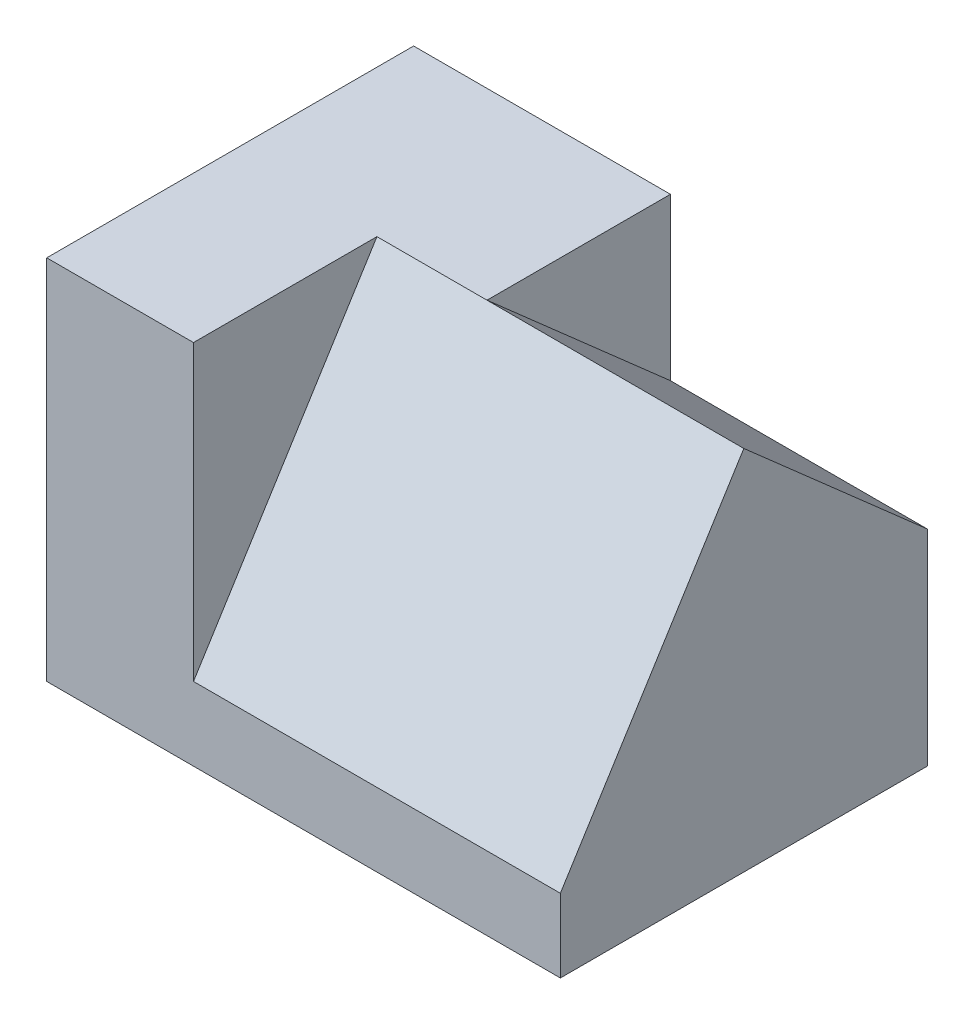
ISO-10303-21;
HEADER;
FILE_DESCRIPTION(('STEP AP214'),'2;1');
FILE_NAME('part.step','',(''),(''),'','','');
FILE_SCHEMA(('AUTOMOTIVE_DESIGN { 1 0 10303 214 1 1 1 1 }'));
ENDSEC;
DATA;
#1=APPLICATION_CONTEXT('core data for automotive mechanical design processes');
#2=APPLICATION_PROTOCOL_DEFINITION('international standard','automotive_design',2000,#1);
#3=PRODUCT_CONTEXT('',#1,'mechanical');
#4=PRODUCT('Part','Part','',(#3));
#5=PRODUCT_RELATED_PRODUCT_CATEGORY('part','',(#4));
#6=PRODUCT_DEFINITION_FORMATION('','',#4);
#7=PRODUCT_DEFINITION_CONTEXT('part definition',#1,'design');
#8=PRODUCT_DEFINITION('design','',#6,#7);
#9=PRODUCT_DEFINITION_SHAPE('','',#8);
#10=(LENGTH_UNIT() NAMED_UNIT(*) SI_UNIT(.MILLI.,.METRE.));
#11=(NAMED_UNIT(*) PLANE_ANGLE_UNIT() SI_UNIT($,.RADIAN.));
#12=(NAMED_UNIT(*) SI_UNIT($,.STERADIAN.) SOLID_ANGLE_UNIT());
#13=UNCERTAINTY_MEASURE_WITH_UNIT(LENGTH_MEASURE(1.E-05),#10,'distance_accuracy_value','');
#14=(GEOMETRIC_REPRESENTATION_CONTEXT(3) GLOBAL_UNCERTAINTY_ASSIGNED_CONTEXT((#13)) GLOBAL_UNIT_ASSIGNED_CONTEXT((#10,
#11,#12)) REPRESENTATION_CONTEXT('',''));
#15=CARTESIAN_POINT('',(0.,0.,0.));
#16=DIRECTION('',(0.,0.,1.));
#17=DIRECTION('',(1.,0.,0.));
#18=AXIS2_PLACEMENT_3D('',#15,#16,#17);
#19=CARTESIAN_POINT('',(1778.,1270.,0.));
#20=DIRECTION('',(-1.,0.,0.));
#21=DIRECTION('',(0.,0.,1.));
#22=AXIS2_PLACEMENT_3D('',#19,#20,#21);
#23=PLANE('',#22);
#24=DIRECTION('',(0.,-0.660627894892025,-0.750713516922755));
#25=VECTOR('',#24,1.);
#26=CARTESIAN_POINT('',(1778.,1584.92335437331,-277.132551848512));
#27=LINE('',#26,#25);
#28=CARTESIAN_POINT('',(1778.,1270.,-635.));
#29=VERTEX_POINT('',#28);
#30=CARTESIAN_POINT('',(1778.,711.2,-1270.));
#31=VERTEX_POINT('',#30);
#32=EDGE_CURVE('E114',#29,#31,#27,.T.);
#33=ORIENTED_EDGE('',*,*,#32,.F.);
#34=DIRECTION('',(0.,-0.847998304005088,0.52999894000318));
#35=VECTOR('',#34,1.);
#36=CARTESIAN_POINT('',(1778.,984.606741573034,-456.629213483146));
#37=LINE('',#36,#35);
#38=CARTESIAN_POINT('',(1778.,254.,0.));
#39=VERTEX_POINT('',#38);
#40=EDGE_CURVE('E146',#29,#39,#37,.T.);
#41=ORIENTED_EDGE('',*,*,#40,.T.);
#42=DIRECTION('',(0.,-1.,0.));
#43=VECTOR('',#42,1.);
#44=CARTESIAN_POINT('',(1778.,1270.,0.));
#45=LINE('',#44,#43);
#46=CARTESIAN_POINT('',(1778.,0.,0.));
#47=VERTEX_POINT('',#46);
#48=EDGE_CURVE('E182',#39,#47,#45,.T.);
#49=ORIENTED_EDGE('',*,*,#48,.T.);
#50=DIRECTION('',(0.,0.,-1.));
#51=VECTOR('',#50,1.);
#52=CARTESIAN_POINT('',(1778.,0.,0.));
#53=LINE('',#52,#51);
#54=CARTESIAN_POINT('',(1778.,0.,-1270.));
#55=VERTEX_POINT('',#54);
#56=EDGE_CURVE('E170',#47,#55,#53,.T.);
#57=ORIENTED_EDGE('',*,*,#56,.T.);
#58=DIRECTION('',(0.,-1.,0.));
#59=VECTOR('',#58,1.);
#60=CARTESIAN_POINT('',(1778.,1270.,-1270.));
#61=LINE('',#60,#59);
#62=EDGE_CURVE('E179',#31,#55,#61,.T.);
#63=ORIENTED_EDGE('',*,*,#62,.F.);
#64=EDGE_LOOP('',(#33,#41,#49,#57,#63));
#65=FACE_BOUND('',#64,.T.);
#66=ADVANCED_FACE('F46',(#65),#23,.F.);
#67=CARTESIAN_POINT('',(0.,1270.,-1270.));
#68=DIRECTION('',(0.,0.,1.));
#69=DIRECTION('',(1.,0.,0.));
#70=AXIS2_PLACEMENT_3D('',#67,#68,#69);
#71=PLANE('',#70);
#72=DIRECTION('',(-1.,0.,0.));
#73=VECTOR('',#72,1.);
#74=CARTESIAN_POINT('',(1778.000012,711.2,-1270.));
#75=LINE('',#74,#73);
#76=CARTESIAN_POINT('',(889.,711.2,-1270.));
#77=VERTEX_POINT('',#76);
#78=EDGE_CURVE('E109',#31,#77,#75,.T.);
#79=ORIENTED_EDGE('',*,*,#78,.F.);
#80=ORIENTED_EDGE('',*,*,#62,.T.);
#81=DIRECTION('',(-1.,0.,0.));
#82=VECTOR('',#81,1.);
#83=CARTESIAN_POINT('',(0.,0.,-1270.));
#84=LINE('',#83,#82);
#85=CARTESIAN_POINT('',(0.,0.,-1270.));
#86=VERTEX_POINT('',#85);
#87=EDGE_CURVE('E156',#55,#86,#84,.T.);
#88=ORIENTED_EDGE('',*,*,#87,.T.);
#89=DIRECTION('',(0.,-1.,0.));
#90=VECTOR('',#89,1.);
#91=CARTESIAN_POINT('',(0.,1270.,-1270.));
#92=LINE('',#91,#90);
#93=CARTESIAN_POINT('',(0.,1270.,-1270.));
#94=VERTEX_POINT('',#93);
#95=EDGE_CURVE('E162',#94,#86,#92,.T.);
#96=ORIENTED_EDGE('',*,*,#95,.F.);
#97=DIRECTION('',(-1.,0.,0.));
#98=VECTOR('',#97,1.);
#99=CARTESIAN_POINT('',(0.,1270.,-1270.));
#100=LINE('',#99,#98);
#101=CARTESIAN_POINT('',(889.,1270.,-1270.));
#102=VERTEX_POINT('',#101);
#103=EDGE_CURVE('E127',#102,#94,#100,.T.);
#104=ORIENTED_EDGE('',*,*,#103,.F.);
#105=DIRECTION('',(0.,1.,0.));
#106=VECTOR('',#105,1.);
#107=CARTESIAN_POINT('',(889.,0.,-1270.));
#108=LINE('',#107,#106);
#109=EDGE_CURVE('E119',#77,#102,#108,.T.);
#110=ORIENTED_EDGE('',*,*,#109,.F.);
#111=EDGE_LOOP('',(#79,#80,#88,#96,#104,#110));
#112=FACE_BOUND('',#111,.T.);
#113=ADVANCED_FACE('F125',(#112),#71,.F.);
#114=CARTESIAN_POINT('',(0.,1270.,0.));
#115=DIRECTION('',(0.,-1.,0.));
#116=DIRECTION('',(0.,0.,-1.));
#117=AXIS2_PLACEMENT_3D('',#114,#115,#116);
#118=PLANE('',#117);
#119=DIRECTION('',(0.,0.,1.));
#120=VECTOR('',#119,1.);
#121=CARTESIAN_POINT('',(889.,1270.,1.27142395458908E-13));
#122=LINE('',#121,#120);
#123=CARTESIAN_POINT('',(889.,1270.,-635.));
#124=VERTEX_POINT('',#123);
#125=EDGE_CURVE('E62',#102,#124,#122,.T.);
#126=ORIENTED_EDGE('',*,*,#125,.F.);
#127=ORIENTED_EDGE('',*,*,#103,.T.);
#128=DIRECTION('',(0.,0.,1.));
#129=VECTOR('',#128,1.);
#130=CARTESIAN_POINT('',(0.,1270.,0.));
#131=LINE('',#130,#129);
#132=CARTESIAN_POINT('',(0.,1270.,0.));
#133=VERTEX_POINT('',#132);
#134=EDGE_CURVE('E151',#94,#133,#131,.T.);
#135=ORIENTED_EDGE('',*,*,#134,.T.);
#136=DIRECTION('',(1.,0.,0.));
#137=VECTOR('',#136,1.);
#138=CARTESIAN_POINT('',(0.,1270.,0.));
#139=LINE('',#138,#137);
#140=CARTESIAN_POINT('',(508.,1270.,-2.22044604925031E-13));
#141=VERTEX_POINT('',#140);
#142=EDGE_CURVE('E155',#133,#141,#139,.T.);
#143=ORIENTED_EDGE('',*,*,#142,.T.);
#144=DIRECTION('',(0.,0.,1.));
#145=VECTOR('',#144,1.);
#146=CARTESIAN_POINT('',(508.,1270.,0.));
#147=LINE('',#146,#145);
#148=CARTESIAN_POINT('',(508.,1270.,-635.));
#149=VERTEX_POINT('',#148);
#150=EDGE_CURVE('E136',#149,#141,#147,.T.);
#151=ORIENTED_EDGE('',*,*,#150,.F.);
#152=DIRECTION('',(1.,0.,0.));
#153=VECTOR('',#152,1.);
#154=CARTESIAN_POINT('',(1.11022302462516E-13,1270.,-635.));
#155=LINE('',#154,#153);
#156=EDGE_CURVE('E12',#149,#124,#155,.T.);
#157=ORIENTED_EDGE('',*,*,#156,.T.);
#158=EDGE_LOOP('',(#126,#127,#135,#143,#151,#157));
#159=FACE_BOUND('',#158,.T.);
#160=ADVANCED_FACE('F205',(#159),#118,.F.);
#161=CARTESIAN_POINT('',(0.,1270.,0.));
#162=DIRECTION('',(1.,0.,0.));
#163=DIRECTION('',(0.,0.,-1.));
#164=AXIS2_PLACEMENT_3D('',#161,#162,#163);
#165=PLANE('',#164);
#166=DIRECTION('',(0.,0.,1.));
#167=VECTOR('',#166,1.);
#168=CARTESIAN_POINT('',(0.,0.,0.));
#169=LINE('',#168,#167);
#170=CARTESIAN_POINT('',(0.,0.,0.));
#171=VERTEX_POINT('',#170);
#172=EDGE_CURVE('E150',#86,#171,#169,.T.);
#173=ORIENTED_EDGE('',*,*,#172,.T.);
#174=DIRECTION('',(0.,-1.,0.));
#175=VECTOR('',#174,1.);
#176=CARTESIAN_POINT('',(0.,1270.,0.));
#177=LINE('',#176,#175);
#178=EDGE_CURVE('E184',#133,#171,#177,.T.);
#179=ORIENTED_EDGE('',*,*,#178,.F.);
#180=ORIENTED_EDGE('',*,*,#134,.F.);
#181=ORIENTED_EDGE('',*,*,#95,.T.);
#182=EDGE_LOOP('',(#173,#179,#180,#181));
#183=FACE_BOUND('',#182,.T.);
#184=ADVANCED_FACE('F48',(#183),#165,.F.);
#185=CARTESIAN_POINT('',(0.,1270.,0.));
#186=DIRECTION('',(0.,0.,-1.));
#187=DIRECTION('',(-1.,0.,0.));
#188=AXIS2_PLACEMENT_3D('',#185,#186,#187);
#189=PLANE('',#188);
#190=ORIENTED_EDGE('',*,*,#48,.F.);
#191=DIRECTION('',(-1.,0.,0.));
#192=VECTOR('',#191,1.);
#193=CARTESIAN_POINT('',(1778.000012,254.,0.));
#194=LINE('',#193,#192);
#195=CARTESIAN_POINT('',(508.,254.,-2.08166817117217E-13));
#196=VERTEX_POINT('',#195);
#197=EDGE_CURVE('E142',#39,#196,#194,.T.);
#198=ORIENTED_EDGE('',*,*,#197,.T.);
#199=DIRECTION('',(0.,-1.,0.));
#200=VECTOR('',#199,1.);
#201=CARTESIAN_POINT('',(508.,0.,-2.22044604925031E-13));
#202=LINE('',#201,#200);
#203=EDGE_CURVE('E139',#141,#196,#202,.T.);
#204=ORIENTED_EDGE('',*,*,#203,.F.);
#205=ORIENTED_EDGE('',*,*,#142,.F.);
#206=ORIENTED_EDGE('',*,*,#178,.T.);
#207=DIRECTION('',(1.,0.,0.));
#208=VECTOR('',#207,1.);
#209=CARTESIAN_POINT('',(0.,0.,0.));
#210=LINE('',#209,#208);
#211=EDGE_CURVE('E166',#171,#47,#210,.T.);
#212=ORIENTED_EDGE('',*,*,#211,.T.);
#213=EDGE_LOOP('',(#190,#198,#204,#205,#206,#212));
#214=FACE_BOUND('',#213,.T.);
#215=ADVANCED_FACE('F196',(#214),#189,.F.);
#216=CARTESIAN_POINT('',(0.,0.,0.));
#217=DIRECTION('',(0.,-1.,0.));
#218=DIRECTION('',(0.,0.,-1.));
#219=AXIS2_PLACEMENT_3D('',#216,#217,#218);
#220=PLANE('',#219);
#221=ORIENTED_EDGE('',*,*,#172,.F.);
#222=ORIENTED_EDGE('',*,*,#87,.F.);
#223=ORIENTED_EDGE('',*,*,#56,.F.);
#224=ORIENTED_EDGE('',*,*,#211,.F.);
#225=EDGE_LOOP('',(#221,#222,#223,#224));
#226=FACE_BOUND('',#225,.T.);
#227=ADVANCED_FACE('F201',(#226),#220,.T.);
#228=CARTESIAN_POINT('',(1778.000012,71.3483146067413,114.157303370786));
#229=DIRECTION('',(0.,-0.52999894000318,-0.847998304005088));
#230=DIRECTION('',(0.,0.847998304005088,-0.52999894000318));
#231=AXIS2_PLACEMENT_3D('',#228,#229,#230);
#232=PLANE('',#231);
#233=ORIENTED_EDGE('',*,*,#156,.F.);
#234=DIRECTION('',(0.,-0.847998304005088,0.52999894000318));
#235=VECTOR('',#234,1.);
#236=CARTESIAN_POINT('',(508.,71.3483146067413,114.157303370786));
#237=LINE('',#236,#235);
#238=EDGE_CURVE('E70',#149,#196,#237,.T.);
#239=ORIENTED_EDGE('',*,*,#238,.T.);
#240=ORIENTED_EDGE('',*,*,#197,.F.);
#241=ORIENTED_EDGE('',*,*,#40,.F.);
#242=EDGE_CURVE('E55',#124,#29,#155,.T.);
#243=ORIENTED_EDGE('',*,*,#242,.F.);
#244=EDGE_LOOP('',(#233,#239,#240,#241,#243));
#245=FACE_BOUND('',#244,.T.);
#246=ADVANCED_FACE('F194',(#245),#232,.F.);
#247=CARTESIAN_POINT('',(508.,0.,0.));
#248=DIRECTION('',(1.,0.,0.));
#249=DIRECTION('',(0.,0.,-1.));
#250=AXIS2_PLACEMENT_3D('',#247,#248,#249);
#251=PLANE('',#250);
#252=ORIENTED_EDGE('',*,*,#238,.F.);
#253=ORIENTED_EDGE('',*,*,#150,.T.);
#254=ORIENTED_EDGE('',*,*,#203,.T.);
#255=EDGE_LOOP('',(#252,#253,#254));
#256=FACE_BOUND('',#255,.T.);
#257=ADVANCED_FACE('F208',(#256),#251,.T.);
#258=CARTESIAN_POINT('',(1778.000012,1030.65825067629,-906.97926059513));
#259=DIRECTION('',(0.,0.750713516922755,-0.660627894892025));
#260=DIRECTION('',(0.,0.660627894892025,0.750713516922755));
#261=AXIS2_PLACEMENT_3D('',#258,#259,#260);
#262=PLANE('',#261);
#263=ORIENTED_EDGE('',*,*,#32,.T.);
#264=ORIENTED_EDGE('',*,*,#78,.T.);
#265=DIRECTION('',(0.,-0.660627894892025,-0.750713516922755));
#266=VECTOR('',#265,1.);
#267=CARTESIAN_POINT('',(889.,1030.65825067629,-906.97926059513));
#268=LINE('',#267,#266);
#269=EDGE_CURVE('E111',#124,#77,#268,.T.);
#270=ORIENTED_EDGE('',*,*,#269,.F.);
#271=ORIENTED_EDGE('',*,*,#242,.T.);
#272=EDGE_LOOP('',(#263,#264,#270,#271));
#273=FACE_BOUND('',#272,.T.);
#274=ADVANCED_FACE('F110',(#273),#262,.T.);
#275=CARTESIAN_POINT('',(889.,0.,1.27142395458908E-13));
#276=DIRECTION('',(1.,0.,0.));
#277=DIRECTION('',(0.,0.,-1.));
#278=AXIS2_PLACEMENT_3D('',#275,#276,#277);
#279=PLANE('',#278);
#280=ORIENTED_EDGE('',*,*,#125,.T.);
#281=ORIENTED_EDGE('',*,*,#269,.T.);
#282=ORIENTED_EDGE('',*,*,#109,.T.);
#283=EDGE_LOOP('',(#280,#281,#282));
#284=FACE_BOUND('',#283,.T.);
#285=ADVANCED_FACE('F121',(#284),#279,.T.);
#286=CLOSED_SHELL('',(#66,#113,#160,#184,#215,#227,#246,#257,#274,#285));
#287=MANIFOLD_SOLID_BREP('B2',#286);
#288=ADVANCED_BREP_SHAPE_REPRESENTATION('',(#18,#287),#14);
#289=SHAPE_DEFINITION_REPRESENTATION(#9,#288);
ENDSEC;
END-ISO-10303-21;
